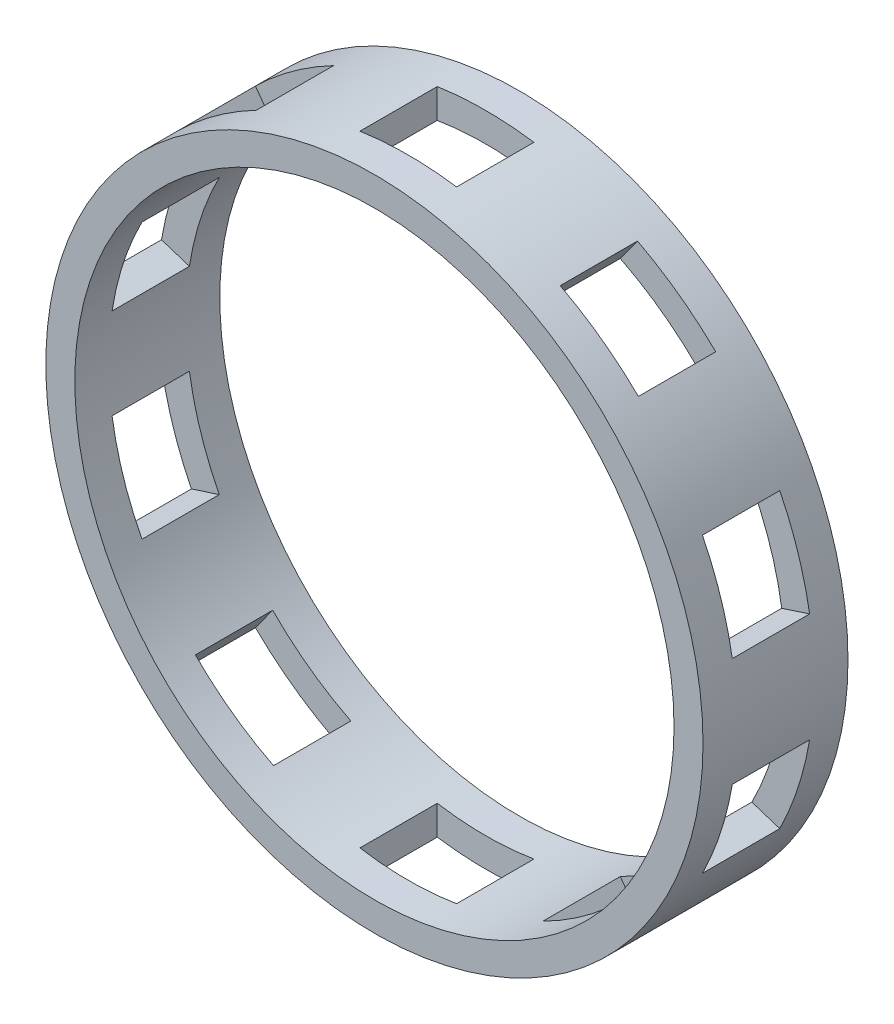
ISO-10303-21;
HEADER;
FILE_DESCRIPTION(('STEP AP214'),'2;1');
FILE_NAME('part.step','',(''),(''),'','','');
FILE_SCHEMA(('AUTOMOTIVE_DESIGN { 1 0 10303 214 1 1 1 1 }'));
ENDSEC;
DATA;
#1=APPLICATION_CONTEXT('core data for automotive mechanical design processes');
#2=APPLICATION_PROTOCOL_DEFINITION('international standard','automotive_design',2000,#1);
#3=PRODUCT_CONTEXT('',#1,'mechanical');
#4=PRODUCT('Part','Part','',(#3));
#5=PRODUCT_RELATED_PRODUCT_CATEGORY('part','',(#4));
#6=PRODUCT_DEFINITION_FORMATION('','',#4);
#7=PRODUCT_DEFINITION_CONTEXT('part definition',#1,'design');
#8=PRODUCT_DEFINITION('design','',#6,#7);
#9=PRODUCT_DEFINITION_SHAPE('','',#8);
#10=(LENGTH_UNIT() NAMED_UNIT(*) SI_UNIT(.MILLI.,.METRE.));
#11=(NAMED_UNIT(*) PLANE_ANGLE_UNIT() SI_UNIT($,.RADIAN.));
#12=(NAMED_UNIT(*) SI_UNIT($,.STERADIAN.) SOLID_ANGLE_UNIT());
#13=UNCERTAINTY_MEASURE_WITH_UNIT(LENGTH_MEASURE(1.E-05),#10,'distance_accuracy_value','');
#14=(GEOMETRIC_REPRESENTATION_CONTEXT(3) GLOBAL_UNCERTAINTY_ASSIGNED_CONTEXT((#13)) GLOBAL_UNIT_ASSIGNED_CONTEXT((#10,
#11,#12)) REPRESENTATION_CONTEXT('',''));
#15=CARTESIAN_POINT('',(0.,0.,0.));
#16=DIRECTION('',(0.,0.,1.));
#17=DIRECTION('',(1.,0.,0.));
#18=AXIS2_PLACEMENT_3D('',#15,#16,#17);
#19=CARTESIAN_POINT('',(0.,0.,30.));
#20=DIRECTION('',(0.,0.,1.));
#21=DIRECTION('',(1.,0.,0.));
#22=AXIS2_PLACEMENT_3D('',#19,#20,#21);
#23=PLANE('',#22);
#24=CARTESIAN_POINT('',(0.,0.,30.));
#25=DIRECTION('',(0.,0.,1.));
#26=DIRECTION('',(1.,0.,0.));
#27=AXIS2_PLACEMENT_3D('',#24,#25,#26);
#28=CIRCLE('',#27,68.);
#29=CARTESIAN_POINT('',(68.,0.,30.));
#30=VERTEX_POINT('',#29);
#31=EDGE_CURVE('E518',#30,#30,#28,.T.);
#32=ORIENTED_EDGE('',*,*,#31,.T.);
#33=EDGE_LOOP('',(#32));
#34=FACE_BOUND('',#33,.T.);
#35=CARTESIAN_POINT('',(0.,0.,30.));
#36=DIRECTION('',(0.,0.,1.));
#37=DIRECTION('',(1.,0.,0.));
#38=AXIS2_PLACEMENT_3D('',#35,#36,#37);
#39=CIRCLE('',#38,62.);
#40=CARTESIAN_POINT('',(62.,0.,30.));
#41=VERTEX_POINT('',#40);
#42=EDGE_CURVE('E512',#41,#41,#39,.T.);
#43=ORIENTED_EDGE('',*,*,#42,.F.);
#44=EDGE_LOOP('',(#43));
#45=FACE_BOUND('',#44,.T.);
#46=ADVANCED_FACE('F33',(#34,#45),#23,.T.);
#47=CARTESIAN_POINT('',(0.,0.,0.));
#48=DIRECTION('',(0.,0.,1.));
#49=DIRECTION('',(1.,0.,0.));
#50=AXIS2_PLACEMENT_3D('',#47,#48,#49);
#51=PLANE('',#50);
#52=CARTESIAN_POINT('',(0.,0.,0.));
#53=DIRECTION('',(0.,0.,1.));
#54=DIRECTION('',(1.,0.,0.));
#55=AXIS2_PLACEMENT_3D('',#52,#53,#54);
#56=CIRCLE('',#55,68.);
#57=CARTESIAN_POINT('',(68.,0.,0.));
#58=VERTEX_POINT('',#57);
#59=EDGE_CURVE('E515',#58,#58,#56,.T.);
#60=ORIENTED_EDGE('',*,*,#59,.F.);
#61=EDGE_LOOP('',(#60));
#62=FACE_BOUND('',#61,.T.);
#63=CARTESIAN_POINT('',(0.,0.,0.));
#64=DIRECTION('',(0.,0.,1.));
#65=DIRECTION('',(1.,0.,0.));
#66=AXIS2_PLACEMENT_3D('',#63,#64,#65);
#67=CIRCLE('',#66,62.);
#68=CARTESIAN_POINT('',(62.,0.,0.));
#69=VERTEX_POINT('',#68);
#70=EDGE_CURVE('E511',#69,#69,#67,.T.);
#71=ORIENTED_EDGE('',*,*,#70,.T.);
#72=EDGE_LOOP('',(#71));
#73=FACE_BOUND('',#72,.T.);
#74=ADVANCED_FACE('F558',(#62,#73),#51,.F.);
#75=CARTESIAN_POINT('',(0.,0.,30.));
#76=DIRECTION('',(0.,0.,-1.));
#77=DIRECTION('',(-1.,0.,0.));
#78=AXIS2_PLACEMENT_3D('',#75,#76,#77);
#79=CYLINDRICAL_SURFACE('',#78,68.);
#80=CARTESIAN_POINT('',(0.,0.,7.));
#81=DIRECTION('',(0.,0.,-1.));
#82=DIRECTION('',(-1.,0.,0.));
#83=AXIS2_PLACEMENT_3D('',#80,#81,#82);
#84=CIRCLE('',#83,68.);
#85=CARTESIAN_POINT('',(-67.0588844945057,11.2741301372895,7.));
#86=VERTEX_POINT('',#85);
#87=CARTESIAN_POINT('',(-60.8785446070068,30.2952604631926,7.));
#88=VERTEX_POINT('',#87);
#89=EDGE_CURVE('E463',#86,#88,#84,.T.);
#90=ORIENTED_EDGE('',*,*,#89,.T.);
#91=DIRECTION('',(0.,0.,-1.));
#92=VECTOR('',#91,1.);
#93=CARTESIAN_POINT('',(-60.8785446070068,30.2952604631926,30.));
#94=LINE('',#93,#92);
#95=CARTESIAN_POINT('',(-60.8785446070068,30.2952604631926,23.));
#96=VERTEX_POINT('',#95);
#97=EDGE_CURVE('E413',#88,#96,#94,.F.);
#98=ORIENTED_EDGE('',*,*,#97,.T.);
#99=CARTESIAN_POINT('',(0.,0.,23.));
#100=DIRECTION('',(0.,0.,1.));
#101=DIRECTION('',(1.,0.,0.));
#102=AXIS2_PLACEMENT_3D('',#99,#100,#101);
#103=CIRCLE('',#102,68.);
#104=CARTESIAN_POINT('',(-67.0588844945057,11.2741301372895,23.));
#105=VERTEX_POINT('',#104);
#106=EDGE_CURVE('E1006',#96,#105,#103,.T.);
#107=ORIENTED_EDGE('',*,*,#106,.T.);
#108=DIRECTION('',(0.,0.,-1.));
#109=VECTOR('',#108,1.);
#110=CARTESIAN_POINT('',(-67.0588844945057,11.2741301372895,30.));
#111=LINE('',#110,#109);
#112=EDGE_CURVE('E464',#105,#86,#111,.T.);
#113=ORIENTED_EDGE('',*,*,#112,.T.);
#114=EDGE_LOOP('',(#90,#98,#107,#113));
#115=FACE_BOUND('',#114,.T.);
#116=DIRECTION('',(0.,0.,-1.));
#117=VECTOR('',#116,1.);
#118=CARTESIAN_POINT('',(60.8785446070068,-30.2952604631926,30.));
#119=LINE('',#118,#117);
#120=CARTESIAN_POINT('',(60.8785446070068,-30.2952604631926,7.));
#121=VERTEX_POINT('',#120);
#122=CARTESIAN_POINT('',(60.8785446070068,-30.2952604631926,23.));
#123=VERTEX_POINT('',#122);
#124=EDGE_CURVE('E473',#121,#123,#119,.F.);
#125=ORIENTED_EDGE('',*,*,#124,.T.);
#126=CARTESIAN_POINT('',(67.0588844945057,-11.2741301372895,23.));
#127=VERTEX_POINT('',#126);
#128=EDGE_CURVE('E466',#123,#127,#103,.T.);
#129=ORIENTED_EDGE('',*,*,#128,.T.);
#130=DIRECTION('',(0.,0.,-1.));
#131=VECTOR('',#130,1.);
#132=CARTESIAN_POINT('',(67.0588844945057,-11.2741301372895,30.));
#133=LINE('',#132,#131);
#134=CARTESIAN_POINT('',(67.0588844945057,-11.2741301372895,7.));
#135=VERTEX_POINT('',#134);
#136=EDGE_CURVE('E470',#127,#135,#133,.T.);
#137=ORIENTED_EDGE('',*,*,#136,.T.);
#138=EDGE_CURVE('E1077',#135,#121,#84,.T.);
#139=ORIENTED_EDGE('',*,*,#138,.T.);
#140=EDGE_LOOP('',(#125,#129,#137,#139));
#141=FACE_BOUND('',#140,.T.);
#142=CARTESIAN_POINT('',(-31.4446698652575,-60.2928912647666,7.));
#143=VERTEX_POINT('',#142);
#144=CARTESIAN_POINT('',(-47.6250097527565,-48.5371862189172,7.));
#145=VERTEX_POINT('',#144);
#146=EDGE_CURVE('E462',#143,#145,#84,.T.);
#147=ORIENTED_EDGE('',*,*,#146,.T.);
#148=DIRECTION('',(0.,0.,-1.));
#149=VECTOR('',#148,1.);
#150=CARTESIAN_POINT('',(-47.6250097527565,-48.5371862189172,30.));
#151=LINE('',#150,#149);
#152=CARTESIAN_POINT('',(-47.6250097527565,-48.5371862189172,23.));
#153=VERTEX_POINT('',#152);
#154=EDGE_CURVE('E453',#145,#153,#151,.F.);
#155=ORIENTED_EDGE('',*,*,#154,.T.);
#156=CARTESIAN_POINT('',(-31.4446698652575,-60.2928912647666,23.));
#157=VERTEX_POINT('',#156);
#158=EDGE_CURVE('E1054',#153,#157,#103,.T.);
#159=ORIENTED_EDGE('',*,*,#158,.T.);
#160=DIRECTION('',(0.,0.,-1.));
#161=VECTOR('',#160,1.);
#162=CARTESIAN_POINT('',(-31.4446698652575,-60.2928912647666,30.));
#163=LINE('',#162,#161);
#164=EDGE_CURVE('E450',#157,#143,#163,.T.);
#165=ORIENTED_EDGE('',*,*,#164,.T.);
#166=EDGE_LOOP('',(#147,#155,#159,#165));
#167=FACE_BOUND('',#166,.T.);
#168=CARTESIAN_POINT('',(47.6250097527572,-48.5371862189165,7.));
#169=VERTEX_POINT('',#168);
#170=CARTESIAN_POINT('',(31.4446698652583,-60.2928912647661,7.));
#171=VERTEX_POINT('',#170);
#172=EDGE_CURVE('E1076',#169,#171,#84,.T.);
#173=ORIENTED_EDGE('',*,*,#172,.T.);
#174=DIRECTION('',(0.,0.,-1.));
#175=VECTOR('',#174,1.);
#176=CARTESIAN_POINT('',(31.4446698652584,-60.2928912647661,30.));
#177=LINE('',#176,#175);
#178=CARTESIAN_POINT('',(31.4446698652583,-60.2928912647661,23.));
#179=VERTEX_POINT('',#178);
#180=EDGE_CURVE('E447',#171,#179,#177,.F.);
#181=ORIENTED_EDGE('',*,*,#180,.T.);
#182=CARTESIAN_POINT('',(47.6250097527572,-48.5371862189165,23.));
#183=VERTEX_POINT('',#182);
#184=EDGE_CURVE('E469',#179,#183,#103,.T.);
#185=ORIENTED_EDGE('',*,*,#184,.T.);
#186=DIRECTION('',(0.,0.,-1.));
#187=VECTOR('',#186,1.);
#188=CARTESIAN_POINT('',(47.6250097527572,-48.5371862189165,30.));
#189=LINE('',#188,#187);
#190=EDGE_CURVE('E444',#183,#169,#189,.T.);
#191=ORIENTED_EDGE('',*,*,#190,.T.);
#192=EDGE_LOOP('',(#173,#181,#185,#191));
#193=FACE_BOUND('',#192,.T.);
#194=CARTESIAN_POINT('',(-67.0588844945056,-11.2741301372904,23.));
#195=VERTEX_POINT('',#194);
#196=CARTESIAN_POINT('',(-60.8785446070064,-30.2952604631934,23.));
#197=VERTEX_POINT('',#196);
#198=EDGE_CURVE('E1053',#195,#197,#103,.T.);
#199=ORIENTED_EDGE('',*,*,#198,.T.);
#200=DIRECTION('',(0.,0.,-1.));
#201=VECTOR('',#200,1.);
#202=CARTESIAN_POINT('',(-60.8785446070064,-30.2952604631934,30.));
#203=LINE('',#202,#201);
#204=CARTESIAN_POINT('',(-60.8785446070064,-30.2952604631934,7.));
#205=VERTEX_POINT('',#204);
#206=EDGE_CURVE('E456',#197,#205,#203,.T.);
#207=ORIENTED_EDGE('',*,*,#206,.T.);
#208=CARTESIAN_POINT('',(-67.0588844945056,-11.2741301372904,7.));
#209=VERTEX_POINT('',#208);
#210=EDGE_CURVE('E459',#205,#209,#84,.T.);
#211=ORIENTED_EDGE('',*,*,#210,.T.);
#212=DIRECTION('',(0.,0.,-1.));
#213=VECTOR('',#212,1.);
#214=CARTESIAN_POINT('',(-67.0588844945056,-11.2741301372904,30.));
#215=LINE('',#214,#213);
#216=EDGE_CURVE('E441',#209,#195,#215,.F.);
#217=ORIENTED_EDGE('',*,*,#216,.T.);
#218=EDGE_LOOP('',(#199,#207,#211,#217));
#219=FACE_BOUND('',#218,.T.);
#220=CARTESIAN_POINT('',(47.6250097527565,48.5371862189172,23.));
#221=VERTEX_POINT('',#220);
#222=CARTESIAN_POINT('',(31.4446698652575,60.2928912647666,23.));
#223=VERTEX_POINT('',#222);
#224=EDGE_CURVE('E1107',#221,#223,#103,.T.);
#225=ORIENTED_EDGE('',*,*,#224,.T.);
#226=DIRECTION('',(0.,0.,-1.));
#227=VECTOR('',#226,1.);
#228=CARTESIAN_POINT('',(31.4446698652575,60.2928912647666,30.));
#229=LINE('',#228,#227);
#230=CARTESIAN_POINT('',(31.4446698652575,60.2928912647666,7.));
#231=VERTEX_POINT('',#230);
#232=EDGE_CURVE('E438',#223,#231,#229,.T.);
#233=ORIENTED_EDGE('',*,*,#232,.T.);
#234=CARTESIAN_POINT('',(47.6250097527565,48.5371862189172,7.));
#235=VERTEX_POINT('',#234);
#236=EDGE_CURVE('E1083',#231,#235,#84,.T.);
#237=ORIENTED_EDGE('',*,*,#236,.T.);
#238=DIRECTION('',(0.,0.,-1.));
#239=VECTOR('',#238,1.);
#240=CARTESIAN_POINT('',(47.6250097527565,48.5371862189172,30.));
#241=LINE('',#240,#239);
#242=EDGE_CURVE('E435',#235,#221,#241,.F.);
#243=ORIENTED_EDGE('',*,*,#242,.T.);
#244=EDGE_LOOP('',(#225,#233,#237,#243));
#245=FACE_BOUND('',#244,.T.);
#246=CARTESIAN_POINT('',(-31.4446698652584,60.2928912647661,23.));
#247=VERTEX_POINT('',#246);
#248=CARTESIAN_POINT('',(-47.6250097527572,48.5371862189165,23.));
#249=VERTEX_POINT('',#248);
#250=EDGE_CURVE('E1055',#247,#249,#103,.T.);
#251=ORIENTED_EDGE('',*,*,#250,.T.);
#252=DIRECTION('',(0.,0.,-1.));
#253=VECTOR('',#252,1.);
#254=CARTESIAN_POINT('',(-47.6250097527572,48.5371862189165,30.));
#255=LINE('',#254,#253);
#256=CARTESIAN_POINT('',(-47.6250097527572,48.5371862189165,7.));
#257=VERTEX_POINT('',#256);
#258=EDGE_CURVE('E432',#249,#257,#255,.T.);
#259=ORIENTED_EDGE('',*,*,#258,.T.);
#260=CARTESIAN_POINT('',(-31.4446698652584,60.2928912647661,7.));
#261=VERTEX_POINT('',#260);
#262=EDGE_CURVE('E1086',#257,#261,#84,.T.);
#263=ORIENTED_EDGE('',*,*,#262,.T.);
#264=DIRECTION('',(0.,0.,-1.));
#265=VECTOR('',#264,1.);
#266=CARTESIAN_POINT('',(-31.4446698652584,60.2928912647661,30.));
#267=LINE('',#266,#265);
#268=EDGE_CURVE('E429',#261,#247,#267,.F.);
#269=ORIENTED_EDGE('',*,*,#268,.T.);
#270=EDGE_LOOP('',(#251,#259,#263,#269));
#271=FACE_BOUND('',#270,.T.);
#272=CARTESIAN_POINT('',(67.0588844945056,11.2741301372904,23.));
#273=VERTEX_POINT('',#272);
#274=CARTESIAN_POINT('',(60.8785446070064,30.2952604631934,23.));
#275=VERTEX_POINT('',#274);
#276=EDGE_CURVE('E308',#273,#275,#103,.T.);
#277=ORIENTED_EDGE('',*,*,#276,.T.);
#278=DIRECTION('',(0.,0.,-1.));
#279=VECTOR('',#278,1.);
#280=CARTESIAN_POINT('',(60.8785446070064,30.2952604631934,30.));
#281=LINE('',#280,#279);
#282=CARTESIAN_POINT('',(60.8785446070064,30.2952604631934,7.));
#283=VERTEX_POINT('',#282);
#284=EDGE_CURVE('E425',#275,#283,#281,.T.);
#285=ORIENTED_EDGE('',*,*,#284,.T.);
#286=CARTESIAN_POINT('',(67.0588844945056,11.2741301372904,7.));
#287=VERTEX_POINT('',#286);
#288=EDGE_CURVE('E1080',#283,#287,#84,.T.);
#289=ORIENTED_EDGE('',*,*,#288,.T.);
#290=DIRECTION('',(0.,0.,-1.));
#291=VECTOR('',#290,1.);
#292=CARTESIAN_POINT('',(67.0588844945056,11.2741301372904,30.));
#293=LINE('',#292,#291);
#294=EDGE_CURVE('E423',#287,#273,#293,.F.);
#295=ORIENTED_EDGE('',*,*,#294,.T.);
#296=EDGE_LOOP('',(#277,#285,#289,#295));
#297=FACE_BOUND('',#296,.T.);
#298=DIRECTION('',(0.,0.,-1.));
#299=VECTOR('',#298,1.);
#300=CARTESIAN_POINT('',(10.,-67.2606868832009,30.));
#301=LINE('',#300,#299);
#302=CARTESIAN_POINT('',(10.,-67.2606868832009,23.));
#303=VERTEX_POINT('',#302);
#304=CARTESIAN_POINT('',(10.,-67.2606868832009,7.));
#305=VERTEX_POINT('',#304);
#306=EDGE_CURVE('E508',#303,#305,#301,.T.);
#307=ORIENTED_EDGE('',*,*,#306,.T.);
#308=CARTESIAN_POINT('',(0.,0.,7.));
#309=DIRECTION('',(0.,0.,-1.));
#310=DIRECTION('',(-1.,0.,0.));
#311=AXIS2_PLACEMENT_3D('',#308,#309,#310);
#312=CIRCLE('',#311,68.);
#313=CARTESIAN_POINT('',(-10.,-67.2606868832009,7.));
#314=VERTEX_POINT('',#313);
#315=EDGE_CURVE('E496',#305,#314,#312,.T.);
#316=ORIENTED_EDGE('',*,*,#315,.T.);
#317=DIRECTION('',(0.,0.,-1.));
#318=VECTOR('',#317,1.);
#319=CARTESIAN_POINT('',(-10.,-67.2606868832009,30.));
#320=LINE('',#319,#318);
#321=CARTESIAN_POINT('',(-10.,-67.2606868832009,23.));
#322=VERTEX_POINT('',#321);
#323=EDGE_CURVE('E495',#314,#322,#320,.F.);
#324=ORIENTED_EDGE('',*,*,#323,.T.);
#325=CARTESIAN_POINT('',(0.,0.,23.));
#326=DIRECTION('',(0.,0.,1.));
#327=DIRECTION('',(1.,0.,0.));
#328=AXIS2_PLACEMENT_3D('',#325,#326,#327);
#329=CIRCLE('',#328,68.);
#330=EDGE_CURVE('E502',#322,#303,#329,.T.);
#331=ORIENTED_EDGE('',*,*,#330,.T.);
#332=EDGE_LOOP('',(#307,#316,#324,#331));
#333=FACE_BOUND('',#332,.T.);
#334=DIRECTION('',(0.,0.,-1.));
#335=VECTOR('',#334,1.);
#336=CARTESIAN_POINT('',(-10.,67.2606868832009,30.));
#337=LINE('',#336,#335);
#338=CARTESIAN_POINT('',(-10.,67.2606868832009,23.));
#339=VERTEX_POINT('',#338);
#340=CARTESIAN_POINT('',(-10.,67.2606868832009,7.));
#341=VERTEX_POINT('',#340);
#342=EDGE_CURVE('E499',#339,#341,#337,.T.);
#343=ORIENTED_EDGE('',*,*,#342,.T.);
#344=CARTESIAN_POINT('',(10.,67.2606868832009,7.));
#345=VERTEX_POINT('',#344);
#346=EDGE_CURVE('E493',#341,#345,#312,.T.);
#347=ORIENTED_EDGE('',*,*,#346,.T.);
#348=DIRECTION('',(0.,0.,-1.));
#349=VECTOR('',#348,1.);
#350=CARTESIAN_POINT('',(10.,67.2606868832009,30.));
#351=LINE('',#350,#349);
#352=CARTESIAN_POINT('',(10.,67.2606868832009,23.));
#353=VERTEX_POINT('',#352);
#354=EDGE_CURVE('E505',#345,#353,#351,.F.);
#355=ORIENTED_EDGE('',*,*,#354,.T.);
#356=EDGE_CURVE('E503',#353,#339,#329,.T.);
#357=ORIENTED_EDGE('',*,*,#356,.T.);
#358=EDGE_LOOP('',(#343,#347,#355,#357));
#359=FACE_BOUND('',#358,.T.);
#360=ORIENTED_EDGE('',*,*,#31,.F.);
#361=EDGE_LOOP('',(#360));
#362=FACE_BOUND('',#361,.T.);
#363=ORIENTED_EDGE('',*,*,#59,.T.);
#364=EDGE_LOOP('',(#363));
#365=FACE_BOUND('',#364,.T.);
#366=ADVANCED_FACE('F35',(#115,#141,#167,#193,#219,#245,#271,#297,#333,#359,#362,#365),#79,.T.);
#367=CARTESIAN_POINT('',(0.,0.,30.));
#368=DIRECTION('',(0.,0.,-1.));
#369=DIRECTION('',(-1.,0.,0.));
#370=AXIS2_PLACEMENT_3D('',#367,#368,#369);
#371=CYLINDRICAL_SURFACE('',#370,62.);
#372=DIRECTION('',(0.,0.,-1.));
#373=VECTOR('',#372,1.);
#374=CARTESIAN_POINT('',(-55.1032988776733,28.4187693751472,30.));
#375=LINE('',#374,#373);
#376=CARTESIAN_POINT('',(-55.1032988776734,28.4187693751472,7.));
#377=VERTEX_POINT('',#376);
#378=CARTESIAN_POINT('',(-55.1032988776734,28.4187693751472,23.));
#379=VERTEX_POINT('',#378);
#380=EDGE_CURVE('E11',#377,#379,#375,.F.);
#381=ORIENTED_EDGE('',*,*,#380,.F.);
#382=CARTESIAN_POINT('',(0.,0.,7.));
#383=DIRECTION('',(0.,0.,-1.));
#384=DIRECTION('',(-1.,0.,0.));
#385=AXIS2_PLACEMENT_3D('',#382,#383,#384);
#386=CIRCLE('',#385,62.);
#387=CARTESIAN_POINT('',(-61.2836387651722,9.39763904924408,7.));
#388=VERTEX_POINT('',#387);
#389=EDGE_CURVE('E322',#388,#377,#386,.T.);
#390=ORIENTED_EDGE('',*,*,#389,.F.);
#391=DIRECTION('',(0.,0.,-1.));
#392=VECTOR('',#391,1.);
#393=CARTESIAN_POINT('',(-61.2836387651722,9.39763904924408,30.));
#394=LINE('',#393,#392);
#395=CARTESIAN_POINT('',(-61.2836387651722,9.39763904924407,23.));
#396=VERTEX_POINT('',#395);
#397=EDGE_CURVE('E324',#396,#388,#394,.T.);
#398=ORIENTED_EDGE('',*,*,#397,.F.);
#399=CARTESIAN_POINT('',(0.,0.,23.));
#400=DIRECTION('',(0.,0.,1.));
#401=DIRECTION('',(1.,0.,0.));
#402=AXIS2_PLACEMENT_3D('',#399,#400,#401);
#403=CIRCLE('',#402,62.);
#404=EDGE_CURVE('E41',#379,#396,#403,.T.);
#405=ORIENTED_EDGE('',*,*,#404,.F.);
#406=EDGE_LOOP('',(#381,#390,#398,#405));
#407=FACE_BOUND('',#406,.T.);
#408=CARTESIAN_POINT('',(55.1032988776734,-28.4187693751472,23.));
#409=VERTEX_POINT('',#408);
#410=CARTESIAN_POINT('',(61.2836387651722,-9.39763904924408,23.));
#411=VERTEX_POINT('',#410);
#412=EDGE_CURVE('E325',#409,#411,#403,.T.);
#413=ORIENTED_EDGE('',*,*,#412,.F.);
#414=DIRECTION('',(0.,0.,-1.));
#415=VECTOR('',#414,1.);
#416=CARTESIAN_POINT('',(55.1032988776733,-28.4187693751472,30.));
#417=LINE('',#416,#415);
#418=CARTESIAN_POINT('',(55.1032988776734,-28.4187693751472,7.));
#419=VERTEX_POINT('',#418);
#420=EDGE_CURVE('E379',#419,#409,#417,.F.);
#421=ORIENTED_EDGE('',*,*,#420,.F.);
#422=CARTESIAN_POINT('',(61.2836387651722,-9.39763904924408,7.));
#423=VERTEX_POINT('',#422);
#424=EDGE_CURVE('E377',#423,#419,#386,.T.);
#425=ORIENTED_EDGE('',*,*,#424,.F.);
#426=DIRECTION('',(0.,0.,-1.));
#427=VECTOR('',#426,1.);
#428=CARTESIAN_POINT('',(61.2836387651722,-9.39763904924408,30.));
#429=LINE('',#428,#427);
#430=EDGE_CURVE('E385',#411,#423,#429,.T.);
#431=ORIENTED_EDGE('',*,*,#430,.F.);
#432=EDGE_LOOP('',(#413,#421,#425,#431));
#433=FACE_BOUND('',#432,.T.);
#434=DIRECTION('',(0.,0.,-1.));
#435=VECTOR('',#434,1.);
#436=CARTESIAN_POINT('',(-44.0557115986458,-43.624468770828,30.));
#437=LINE('',#436,#435);
#438=CARTESIAN_POINT('',(-44.0557115986458,-43.624468770828,7.));
#439=VERTEX_POINT('',#438);
#440=CARTESIAN_POINT('',(-44.0557115986458,-43.624468770828,23.));
#441=VERTEX_POINT('',#440);
#442=EDGE_CURVE('E371',#439,#441,#437,.F.);
#443=ORIENTED_EDGE('',*,*,#442,.F.);
#444=CARTESIAN_POINT('',(-27.8753717111468,-55.3801738166774,7.));
#445=VERTEX_POINT('',#444);
#446=EDGE_CURVE('E369',#445,#439,#386,.T.);
#447=ORIENTED_EDGE('',*,*,#446,.F.);
#448=DIRECTION('',(0.,0.,-1.));
#449=VECTOR('',#448,1.);
#450=CARTESIAN_POINT('',(-27.8753717111468,-55.3801738166774,30.));
#451=LINE('',#450,#449);
#452=CARTESIAN_POINT('',(-27.8753717111468,-55.3801738166774,23.));
#453=VERTEX_POINT('',#452);
#454=EDGE_CURVE('E367',#453,#445,#451,.T.);
#455=ORIENTED_EDGE('',*,*,#454,.F.);
#456=EDGE_CURVE('E361',#441,#453,#403,.T.);
#457=ORIENTED_EDGE('',*,*,#456,.F.);
#458=EDGE_LOOP('',(#443,#447,#455,#457));
#459=FACE_BOUND('',#458,.T.);
#460=DIRECTION('',(0.,0.,-1.));
#461=VECTOR('',#460,1.);
#462=CARTESIAN_POINT('',(27.8753717111476,-55.380173816677,30.));
#463=LINE('',#462,#461);
#464=CARTESIAN_POINT('',(27.8753717111476,-55.380173816677,7.));
#465=VERTEX_POINT('',#464);
#466=CARTESIAN_POINT('',(27.8753717111476,-55.380173816677,23.));
#467=VERTEX_POINT('',#466);
#468=EDGE_CURVE('E360',#465,#467,#463,.F.);
#469=ORIENTED_EDGE('',*,*,#468,.F.);
#470=CARTESIAN_POINT('',(44.0557115986464,-43.6244687708274,7.));
#471=VERTEX_POINT('',#470);
#472=EDGE_CURVE('E358',#471,#465,#386,.T.);
#473=ORIENTED_EDGE('',*,*,#472,.F.);
#474=DIRECTION('',(0.,0.,-1.));
#475=VECTOR('',#474,1.);
#476=CARTESIAN_POINT('',(44.0557115986464,-43.6244687708274,30.));
#477=LINE('',#476,#475);
#478=CARTESIAN_POINT('',(44.0557115986464,-43.6244687708274,23.));
#479=VERTEX_POINT('',#478);
#480=EDGE_CURVE('E355',#479,#471,#477,.T.);
#481=ORIENTED_EDGE('',*,*,#480,.F.);
#482=EDGE_CURVE('E349',#467,#479,#403,.T.);
#483=ORIENTED_EDGE('',*,*,#482,.F.);
#484=EDGE_LOOP('',(#469,#473,#481,#483));
#485=FACE_BOUND('',#484,.T.);
#486=DIRECTION('',(0.,0.,-1.));
#487=VECTOR('',#486,1.);
#488=CARTESIAN_POINT('',(-55.1032988776729,-28.4187693751479,30.));
#489=LINE('',#488,#487);
#490=CARTESIAN_POINT('',(-55.1032988776729,-28.4187693751479,23.));
#491=VERTEX_POINT('',#490);
#492=CARTESIAN_POINT('',(-55.1032988776729,-28.4187693751479,7.));
#493=VERTEX_POINT('',#492);
#494=EDGE_CURVE('E348',#491,#493,#489,.T.);
#495=ORIENTED_EDGE('',*,*,#494,.F.);
#496=CARTESIAN_POINT('',(-61.2836387651721,-9.39763904924494,23.));
#497=VERTEX_POINT('',#496);
#498=EDGE_CURVE('E338',#497,#491,#403,.T.);
#499=ORIENTED_EDGE('',*,*,#498,.F.);
#500=DIRECTION('',(0.,0.,-1.));
#501=VECTOR('',#500,1.);
#502=CARTESIAN_POINT('',(-61.2836387651721,-9.39763904924494,30.));
#503=LINE('',#502,#501);
#504=CARTESIAN_POINT('',(-61.2836387651721,-9.39763904924494,7.));
#505=VERTEX_POINT('',#504);
#506=EDGE_CURVE('E344',#505,#497,#503,.F.);
#507=ORIENTED_EDGE('',*,*,#506,.F.);
#508=EDGE_CURVE('E347',#493,#505,#386,.T.);
#509=ORIENTED_EDGE('',*,*,#508,.F.);
#510=EDGE_LOOP('',(#495,#499,#507,#509));
#511=FACE_BOUND('',#510,.T.);
#512=DIRECTION('',(0.,0.,-1.));
#513=VECTOR('',#512,1.);
#514=CARTESIAN_POINT('',(27.8753717111467,55.3801738166774,30.));
#515=LINE('',#514,#513);
#516=CARTESIAN_POINT('',(27.8753717111468,55.3801738166774,23.));
#517=VERTEX_POINT('',#516);
#518=CARTESIAN_POINT('',(27.8753717111468,55.3801738166774,7.));
#519=VERTEX_POINT('',#518);
#520=EDGE_CURVE('E337',#517,#519,#515,.T.);
#521=ORIENTED_EDGE('',*,*,#520,.F.);
#522=CARTESIAN_POINT('',(44.0557115986458,43.624468770828,23.));
#523=VERTEX_POINT('',#522);
#524=EDGE_CURVE('E327',#523,#517,#403,.T.);
#525=ORIENTED_EDGE('',*,*,#524,.F.);
#526=DIRECTION('',(0.,0.,-1.));
#527=VECTOR('',#526,1.);
#528=CARTESIAN_POINT('',(44.0557115986458,43.624468770828,30.));
#529=LINE('',#528,#527);
#530=CARTESIAN_POINT('',(44.0557115986458,43.624468770828,7.));
#531=VERTEX_POINT('',#530);
#532=EDGE_CURVE('E333',#531,#523,#529,.F.);
#533=ORIENTED_EDGE('',*,*,#532,.F.);
#534=EDGE_CURVE('E336',#519,#531,#386,.T.);
#535=ORIENTED_EDGE('',*,*,#534,.F.);
#536=EDGE_LOOP('',(#521,#525,#533,#535));
#537=FACE_BOUND('',#536,.T.);
#538=DIRECTION('',(0.,0.,-1.));
#539=VECTOR('',#538,1.);
#540=CARTESIAN_POINT('',(-44.0557115986464,43.6244687708274,30.));
#541=LINE('',#540,#539);
#542=CARTESIAN_POINT('',(-44.0557115986464,43.6244687708274,23.));
#543=VERTEX_POINT('',#542);
#544=CARTESIAN_POINT('',(-44.0557115986464,43.6244687708274,7.));
#545=VERTEX_POINT('',#544);
#546=EDGE_CURVE('E326',#543,#545,#541,.T.);
#547=ORIENTED_EDGE('',*,*,#546,.F.);
#548=CARTESIAN_POINT('',(-27.8753717111476,55.380173816677,23.));
#549=VERTEX_POINT('',#548);
#550=EDGE_CURVE('E318',#549,#543,#403,.T.);
#551=ORIENTED_EDGE('',*,*,#550,.F.);
#552=DIRECTION('',(0.,0.,-1.));
#553=VECTOR('',#552,1.);
#554=CARTESIAN_POINT('',(-27.8753717111476,55.380173816677,30.));
#555=LINE('',#554,#553);
#556=CARTESIAN_POINT('',(-27.8753717111476,55.380173816677,7.));
#557=VERTEX_POINT('',#556);
#558=EDGE_CURVE('E319',#557,#549,#555,.F.);
#559=ORIENTED_EDGE('',*,*,#558,.F.);
#560=EDGE_CURVE('E323',#545,#557,#386,.T.);
#561=ORIENTED_EDGE('',*,*,#560,.F.);
#562=EDGE_LOOP('',(#547,#551,#559,#561));
#563=FACE_BOUND('',#562,.T.);
#564=DIRECTION('',(0.,0.,-1.));
#565=VECTOR('',#564,1.);
#566=CARTESIAN_POINT('',(55.1032988776729,28.4187693751479,30.));
#567=LINE('',#566,#565);
#568=CARTESIAN_POINT('',(55.1032988776729,28.4187693751479,23.));
#569=VERTEX_POINT('',#568);
#570=CARTESIAN_POINT('',(55.1032988776729,28.4187693751479,7.));
#571=VERTEX_POINT('',#570);
#572=EDGE_CURVE('E316',#569,#571,#567,.T.);
#573=ORIENTED_EDGE('',*,*,#572,.F.);
#574=CARTESIAN_POINT('',(61.2836387651721,9.39763904924493,23.));
#575=VERTEX_POINT('',#574);
#576=EDGE_CURVE('E305',#575,#569,#403,.T.);
#577=ORIENTED_EDGE('',*,*,#576,.F.);
#578=DIRECTION('',(0.,0.,-1.));
#579=VECTOR('',#578,1.);
#580=CARTESIAN_POINT('',(61.2836387651721,9.39763904924494,30.));
#581=LINE('',#580,#579);
#582=CARTESIAN_POINT('',(61.2836387651721,9.39763904924494,7.));
#583=VERTEX_POINT('',#582);
#584=EDGE_CURVE('E288',#583,#575,#581,.F.);
#585=ORIENTED_EDGE('',*,*,#584,.F.);
#586=EDGE_CURVE('E299',#571,#583,#386,.T.);
#587=ORIENTED_EDGE('',*,*,#586,.F.);
#588=EDGE_LOOP('',(#573,#577,#585,#587));
#589=FACE_BOUND('',#588,.T.);
#590=DIRECTION('',(0.,0.,-1.));
#591=VECTOR('',#590,1.);
#592=CARTESIAN_POINT('',(10.,61.1882341631134,30.));
#593=LINE('',#592,#591);
#594=CARTESIAN_POINT('',(10.,61.1882341631134,7.));
#595=VERTEX_POINT('',#594);
#596=CARTESIAN_POINT('',(10.,61.1882341631134,23.));
#597=VERTEX_POINT('',#596);
#598=EDGE_CURVE('E300',#595,#597,#593,.F.);
#599=ORIENTED_EDGE('',*,*,#598,.F.);
#600=CARTESIAN_POINT('',(0.,0.,7.));
#601=DIRECTION('',(0.,0.,-1.));
#602=DIRECTION('',(-1.,0.,0.));
#603=AXIS2_PLACEMENT_3D('',#600,#601,#602);
#604=CIRCLE('',#603,62.);
#605=CARTESIAN_POINT('',(-10.,61.1882341631134,7.));
#606=VERTEX_POINT('',#605);
#607=EDGE_CURVE('E526',#606,#595,#604,.T.);
#608=ORIENTED_EDGE('',*,*,#607,.F.);
#609=DIRECTION('',(0.,0.,-1.));
#610=VECTOR('',#609,1.);
#611=CARTESIAN_POINT('',(-10.,61.1882341631134,30.));
#612=LINE('',#611,#610);
#613=CARTESIAN_POINT('',(-10.,61.1882341631134,23.));
#614=VERTEX_POINT('',#613);
#615=EDGE_CURVE('E534',#614,#606,#612,.T.);
#616=ORIENTED_EDGE('',*,*,#615,.F.);
#617=CARTESIAN_POINT('',(0.,0.,23.));
#618=DIRECTION('',(0.,0.,1.));
#619=DIRECTION('',(1.,0.,0.));
#620=AXIS2_PLACEMENT_3D('',#617,#618,#619);
#621=CIRCLE('',#620,62.);
#622=EDGE_CURVE('E531',#597,#614,#621,.T.);
#623=ORIENTED_EDGE('',*,*,#622,.F.);
#624=EDGE_LOOP('',(#599,#608,#616,#623));
#625=FACE_BOUND('',#624,.T.);
#626=DIRECTION('',(0.,0.,-1.));
#627=VECTOR('',#626,1.);
#628=CARTESIAN_POINT('',(10.,-61.1882341631134,30.));
#629=LINE('',#628,#627);
#630=CARTESIAN_POINT('',(10.,-61.1882341631134,23.));
#631=VERTEX_POINT('',#630);
#632=CARTESIAN_POINT('',(10.,-61.1882341631134,7.));
#633=VERTEX_POINT('',#632);
#634=EDGE_CURVE('E530',#631,#633,#629,.T.);
#635=ORIENTED_EDGE('',*,*,#634,.F.);
#636=CARTESIAN_POINT('',(-10.,-61.1882341631134,23.));
#637=VERTEX_POINT('',#636);
#638=EDGE_CURVE('E528',#637,#631,#621,.T.);
#639=ORIENTED_EDGE('',*,*,#638,.F.);
#640=DIRECTION('',(0.,0.,-1.));
#641=VECTOR('',#640,1.);
#642=CARTESIAN_POINT('',(-10.,-61.1882341631134,30.));
#643=LINE('',#642,#641);
#644=CARTESIAN_POINT('',(-10.,-61.1882341631134,7.));
#645=VERTEX_POINT('',#644);
#646=EDGE_CURVE('E525',#645,#637,#643,.F.);
#647=ORIENTED_EDGE('',*,*,#646,.F.);
#648=EDGE_CURVE('E521',#633,#645,#604,.T.);
#649=ORIENTED_EDGE('',*,*,#648,.F.);
#650=EDGE_LOOP('',(#635,#639,#647,#649));
#651=FACE_BOUND('',#650,.T.);
#652=ORIENTED_EDGE('',*,*,#42,.T.);
#653=EDGE_LOOP('',(#652));
#654=FACE_BOUND('',#653,.T.);
#655=ORIENTED_EDGE('',*,*,#70,.F.);
#656=EDGE_LOOP('',(#655));
#657=FACE_BOUND('',#656,.T.);
#658=ADVANCED_FACE('F314',(#407,#433,#459,#485,#511,#537,#563,#589,#625,#651,#654,#657),#371,.F.);
#659=CARTESIAN_POINT('',(-10.,-68.,7.));
#660=DIRECTION('',(0.,0.,-1.));
#661=DIRECTION('',(-1.,0.,0.));
#662=AXIS2_PLACEMENT_3D('',#659,#660,#661);
#663=PLANE('',#662);
#664=DIRECTION('',(0.,1.,0.));
#665=VECTOR('',#664,1.);
#666=CARTESIAN_POINT('',(10.,-68.,7.));
#667=LINE('',#666,#665);
#668=EDGE_CURVE('E490',#305,#633,#667,.T.);
#669=ORIENTED_EDGE('',*,*,#668,.T.);
#670=ORIENTED_EDGE('',*,*,#648,.T.);
#671=DIRECTION('',(0.,1.,0.));
#672=VECTOR('',#671,1.);
#673=CARTESIAN_POINT('',(-10.,-68.,7.));
#674=LINE('',#673,#672);
#675=EDGE_CURVE('E486',#314,#645,#674,.T.);
#676=ORIENTED_EDGE('',*,*,#675,.F.);
#677=ORIENTED_EDGE('',*,*,#315,.F.);
#678=EDGE_LOOP('',(#669,#670,#676,#677));
#679=FACE_BOUND('',#678,.T.);
#680=ADVANCED_FACE('F569',(#679),#663,.F.);
#681=CARTESIAN_POINT('',(-10.,-68.,23.));
#682=DIRECTION('',(-1.,0.,0.));
#683=DIRECTION('',(0.,0.,1.));
#684=AXIS2_PLACEMENT_3D('',#681,#682,#683);
#685=PLANE('',#684);
#686=ORIENTED_EDGE('',*,*,#675,.T.);
#687=ORIENTED_EDGE('',*,*,#646,.T.);
#688=DIRECTION('',(0.,1.,0.));
#689=VECTOR('',#688,1.);
#690=CARTESIAN_POINT('',(-10.,-68.,23.));
#691=LINE('',#690,#689);
#692=EDGE_CURVE('E482',#322,#637,#691,.T.);
#693=ORIENTED_EDGE('',*,*,#692,.F.);
#694=ORIENTED_EDGE('',*,*,#323,.F.);
#695=EDGE_LOOP('',(#686,#687,#693,#694));
#696=FACE_BOUND('',#695,.T.);
#697=ADVANCED_FACE('F574',(#696),#685,.F.);
#698=CARTESIAN_POINT('',(-10.,-68.,23.));
#699=DIRECTION('',(0.,0.,1.));
#700=DIRECTION('',(1.,0.,0.));
#701=AXIS2_PLACEMENT_3D('',#698,#699,#700);
#702=PLANE('',#701);
#703=ORIENTED_EDGE('',*,*,#692,.T.);
#704=ORIENTED_EDGE('',*,*,#638,.T.);
#705=DIRECTION('',(0.,1.,0.));
#706=VECTOR('',#705,1.);
#707=CARTESIAN_POINT('',(10.,-68.,23.));
#708=LINE('',#707,#706);
#709=EDGE_CURVE('E481',#303,#631,#708,.T.);
#710=ORIENTED_EDGE('',*,*,#709,.F.);
#711=ORIENTED_EDGE('',*,*,#330,.F.);
#712=EDGE_LOOP('',(#703,#704,#710,#711));
#713=FACE_BOUND('',#712,.T.);
#714=ADVANCED_FACE('F931',(#713),#702,.F.);
#715=CARTESIAN_POINT('',(10.,-68.,23.));
#716=DIRECTION('',(1.,0.,0.));
#717=DIRECTION('',(0.,0.,-1.));
#718=AXIS2_PLACEMENT_3D('',#715,#716,#717);
#719=PLANE('',#718);
#720=ORIENTED_EDGE('',*,*,#709,.T.);
#721=ORIENTED_EDGE('',*,*,#634,.T.);
#722=ORIENTED_EDGE('',*,*,#668,.F.);
#723=ORIENTED_EDGE('',*,*,#306,.F.);
#724=EDGE_LOOP('',(#720,#721,#722,#723));
#725=FACE_BOUND('',#724,.T.);
#726=ADVANCED_FACE('F933',(#725),#719,.F.);
#727=EDGE_CURVE('E477',#595,#345,#667,.T.);
#728=ORIENTED_EDGE('',*,*,#727,.F.);
#729=ORIENTED_EDGE('',*,*,#598,.T.);
#730=EDGE_CURVE('E478',#597,#353,#708,.T.);
#731=ORIENTED_EDGE('',*,*,#730,.T.);
#732=ORIENTED_EDGE('',*,*,#354,.F.);
#733=EDGE_LOOP('',(#728,#729,#731,#732));
#734=FACE_BOUND('',#733,.T.);
#735=ADVANCED_FACE('F554',(#734),#719,.F.);
#736=ORIENTED_EDGE('',*,*,#730,.F.);
#737=ORIENTED_EDGE('',*,*,#622,.T.);
#738=EDGE_CURVE('E483',#614,#339,#691,.T.);
#739=ORIENTED_EDGE('',*,*,#738,.T.);
#740=ORIENTED_EDGE('',*,*,#356,.F.);
#741=EDGE_LOOP('',(#736,#737,#739,#740));
#742=FACE_BOUND('',#741,.T.);
#743=ADVANCED_FACE('F544',(#742),#702,.F.);
#744=ORIENTED_EDGE('',*,*,#738,.F.);
#745=ORIENTED_EDGE('',*,*,#615,.T.);
#746=EDGE_CURVE('E487',#606,#341,#674,.T.);
#747=ORIENTED_EDGE('',*,*,#746,.T.);
#748=ORIENTED_EDGE('',*,*,#342,.F.);
#749=EDGE_LOOP('',(#744,#745,#747,#748));
#750=FACE_BOUND('',#749,.T.);
#751=ADVANCED_FACE('F548',(#750),#685,.F.);
#752=ORIENTED_EDGE('',*,*,#746,.F.);
#753=ORIENTED_EDGE('',*,*,#607,.T.);
#754=ORIENTED_EDGE('',*,*,#727,.T.);
#755=ORIENTED_EDGE('',*,*,#346,.F.);
#756=EDGE_LOOP('',(#752,#753,#754,#755));
#757=FACE_BOUND('',#756,.T.);
#758=ADVANCED_FACE('F552',(#757),#663,.F.);
#759=CARTESIAN_POINT('',(-78.4011064429429,-35.9886859321485,23.));
#760=DIRECTION('',(0.309016994374958,-0.95105651629515,0.));
#761=DIRECTION('',(0.95105651629515,0.309016994374958,0.));
#762=AXIS2_PLACEMENT_3D('',#759,#760,#761);
#763=PLANE('',#762);
#764=DIRECTION('',(0.95105651629515,0.309016994374958,0.));
#765=VECTOR('',#764,1.);
#766=CARTESIAN_POINT('',(-78.4011064429429,-35.9886859321485,7.));
#767=LINE('',#766,#765);
#768=EDGE_CURVE('E294',#583,#287,#767,.T.);
#769=ORIENTED_EDGE('',*,*,#768,.F.);
#770=ORIENTED_EDGE('',*,*,#584,.T.);
#771=DIRECTION('',(0.95105651629515,0.309016994374958,0.));
#772=VECTOR('',#771,1.);
#773=CARTESIAN_POINT('',(-78.4011064429429,-35.9886859321485,23.));
#774=LINE('',#773,#772);
#775=EDGE_CURVE('E291',#575,#273,#774,.T.);
#776=ORIENTED_EDGE('',*,*,#775,.T.);
#777=ORIENTED_EDGE('',*,*,#294,.F.);
#778=EDGE_LOOP('',(#769,#770,#776,#777));
#779=FACE_BOUND('',#778,.T.);
#780=ADVANCED_FACE('F290',(#779),#763,.F.);
#781=CARTESIAN_POINT('',(-84.581446330442,-16.9675556062455,23.));
#782=DIRECTION('',(-0.309016994374958,0.95105651629515,0.));
#783=DIRECTION('',(-0.95105651629515,-0.309016994374958,0.));
#784=AXIS2_PLACEMENT_3D('',#781,#782,#783);
#785=PLANE('',#784);
#786=DIRECTION('',(0.95105651629515,0.309016994374958,0.));
#787=VECTOR('',#786,1.);
#788=CARTESIAN_POINT('',(-84.581446330442,-16.9675556062455,23.));
#789=LINE('',#788,#787);
#790=EDGE_CURVE('E1041',#569,#275,#789,.T.);
#791=ORIENTED_EDGE('',*,*,#790,.F.);
#792=ORIENTED_EDGE('',*,*,#572,.T.);
#793=DIRECTION('',(0.95105651629515,0.309016994374958,0.));
#794=VECTOR('',#793,1.);
#795=CARTESIAN_POINT('',(-84.581446330442,-16.9675556062455,7.));
#796=LINE('',#795,#794);
#797=EDGE_CURVE('E1038',#571,#283,#796,.T.);
#798=ORIENTED_EDGE('',*,*,#797,.T.);
#799=ORIENTED_EDGE('',*,*,#284,.F.);
#800=EDGE_LOOP('',(#791,#792,#798,#799));
#801=FACE_BOUND('',#800,.T.);
#802=ADVANCED_FACE('F614',(#801),#785,.F.);
#803=CARTESIAN_POINT('',(78.4011064429428,-35.9886859321472,7.));
#804=DIRECTION('',(0.,0.,-1.));
#805=DIRECTION('',(-1.,0.,0.));
#806=AXIS2_PLACEMENT_3D('',#803,#804,#805);
#807=PLANE('',#806);
#808=ORIENTED_EDGE('',*,*,#797,.F.);
#809=ORIENTED_EDGE('',*,*,#586,.T.);
#810=ORIENTED_EDGE('',*,*,#768,.T.);
#811=ORIENTED_EDGE('',*,*,#288,.F.);
#812=EDGE_LOOP('',(#808,#809,#810,#811));
#813=FACE_BOUND('',#812,.T.);
#814=ADVANCED_FACE('F624',(#813),#807,.F.);
#815=CARTESIAN_POINT('',(78.4011064429428,-35.9886859321472,23.));
#816=DIRECTION('',(0.,0.,1.));
#817=DIRECTION('',(1.,0.,0.));
#818=AXIS2_PLACEMENT_3D('',#815,#816,#817);
#819=PLANE('',#818);
#820=ORIENTED_EDGE('',*,*,#775,.F.);
#821=ORIENTED_EDGE('',*,*,#576,.T.);
#822=ORIENTED_EDGE('',*,*,#790,.T.);
#823=ORIENTED_EDGE('',*,*,#276,.F.);
#824=EDGE_LOOP('',(#820,#821,#822,#823));
#825=FACE_BOUND('',#824,.T.);
#826=ADVANCED_FACE('F303',(#825),#819,.F.);
#827=CARTESIAN_POINT('',(-47.7391738015383,82.7203518857079,23.));
#828=DIRECTION('',(0.809016994374942,0.58778525229248,0.));
#829=DIRECTION('',(-0.58778525229248,0.809016994374942,0.));
#830=AXIS2_PLACEMENT_3D('',#827,#828,#829);
#831=PLANE('',#830);
#832=DIRECTION('',(0.58778525229248,-0.809016994374942,0.));
#833=VECTOR('',#832,1.);
#834=CARTESIAN_POINT('',(-47.7391738015383,82.7203518857079,7.));
#835=LINE('',#834,#833);
#836=EDGE_CURVE('E1028',#261,#557,#835,.T.);
#837=ORIENTED_EDGE('',*,*,#836,.T.);
#838=ORIENTED_EDGE('',*,*,#558,.T.);
#839=DIRECTION('',(0.58778525229248,-0.809016994374942,0.));
#840=VECTOR('',#839,1.);
#841=CARTESIAN_POINT('',(-47.7391738015383,82.7203518857079,23.));
#842=LINE('',#841,#840);
#843=EDGE_CURVE('E1031',#247,#549,#842,.T.);
#844=ORIENTED_EDGE('',*,*,#843,.F.);
#845=ORIENTED_EDGE('',*,*,#268,.F.);
#846=EDGE_LOOP('',(#837,#838,#844,#845));
#847=FACE_BOUND('',#846,.T.);
#848=ADVANCED_FACE('F649',(#847),#831,.F.);
#849=CARTESIAN_POINT('',(-63.9195136890372,70.9646468398582,23.));
#850=DIRECTION('',(-0.809016994374942,-0.58778525229248,0.));
#851=DIRECTION('',(0.58778525229248,-0.809016994374942,0.));
#852=AXIS2_PLACEMENT_3D('',#849,#850,#851);
#853=PLANE('',#852);
#854=DIRECTION('',(0.58778525229248,-0.809016994374942,0.));
#855=VECTOR('',#854,1.);
#856=CARTESIAN_POINT('',(-63.9195136890372,70.9646468398582,23.));
#857=LINE('',#856,#855);
#858=EDGE_CURVE('E1014',#249,#543,#857,.T.);
#859=ORIENTED_EDGE('',*,*,#858,.T.);
#860=ORIENTED_EDGE('',*,*,#546,.T.);
#861=DIRECTION('',(0.58778525229248,-0.809016994374942,0.));
#862=VECTOR('',#861,1.);
#863=CARTESIAN_POINT('',(-63.9195136890372,70.9646468398582,7.));
#864=LINE('',#863,#862);
#865=EDGE_CURVE('E1025',#257,#545,#864,.T.);
#866=ORIENTED_EDGE('',*,*,#865,.F.);
#867=ORIENTED_EDGE('',*,*,#258,.F.);
#868=EDGE_LOOP('',(#859,#860,#866,#867));
#869=FACE_BOUND('',#868,.T.);
#870=ADVANCED_FACE('F661',(#869),#853,.F.);
#871=ORIENTED_EDGE('',*,*,#865,.T.);
#872=ORIENTED_EDGE('',*,*,#560,.T.);
#873=ORIENTED_EDGE('',*,*,#836,.F.);
#874=ORIENTED_EDGE('',*,*,#262,.F.);
#875=EDGE_LOOP('',(#871,#872,#873,#874));
#876=FACE_BOUND('',#875,.T.);
#877=ADVANCED_FACE('F672',(#876),#807,.F.);
#878=ORIENTED_EDGE('',*,*,#843,.T.);
#879=ORIENTED_EDGE('',*,*,#550,.T.);
#880=ORIENTED_EDGE('',*,*,#858,.F.);
#881=ORIENTED_EDGE('',*,*,#250,.F.);
#882=EDGE_LOOP('',(#878,#879,#880,#881));
#883=FACE_BOUND('',#882,.T.);
#884=ADVANCED_FACE('F684',(#883),#819,.F.);
#885=CARTESIAN_POINT('',(63.919513689036,70.964646839859,23.));
#886=DIRECTION('',(0.809016994374951,-0.587785252292469,0.));
#887=DIRECTION('',(0.587785252292469,0.809016994374951,0.));
#888=AXIS2_PLACEMENT_3D('',#885,#886,#887);
#889=PLANE('',#888);
#890=DIRECTION('',(-0.587785252292469,-0.809016994374951,0.));
#891=VECTOR('',#890,1.);
#892=CARTESIAN_POINT('',(63.919513689036,70.964646839859,7.));
#893=LINE('',#892,#891);
#894=EDGE_CURVE('E1017',#235,#531,#893,.T.);
#895=ORIENTED_EDGE('',*,*,#894,.T.);
#896=ORIENTED_EDGE('',*,*,#532,.T.);
#897=DIRECTION('',(-0.587785252292469,-0.809016994374951,0.));
#898=VECTOR('',#897,1.);
#899=CARTESIAN_POINT('',(63.919513689036,70.964646839859,23.));
#900=LINE('',#899,#898);
#901=EDGE_CURVE('E1019',#221,#523,#900,.T.);
#902=ORIENTED_EDGE('',*,*,#901,.F.);
#903=ORIENTED_EDGE('',*,*,#242,.F.);
#904=EDGE_LOOP('',(#895,#896,#902,#903));
#905=FACE_BOUND('',#904,.T.);
#906=ADVANCED_FACE('F695',(#905),#889,.F.);
#907=CARTESIAN_POINT('',(47.739173801537,82.7203518857084,23.));
#908=DIRECTION('',(-0.809016994374951,0.587785252292469,0.));
#909=DIRECTION('',(-0.587785252292469,-0.809016994374951,0.));
#910=AXIS2_PLACEMENT_3D('',#907,#908,#909);
#911=PLANE('',#910);
#912=DIRECTION('',(-0.587785252292469,-0.809016994374951,0.));
#913=VECTOR('',#912,1.);
#914=CARTESIAN_POINT('',(47.739173801537,82.7203518857084,23.));
#915=LINE('',#914,#913);
#916=EDGE_CURVE('E416',#223,#517,#915,.T.);
#917=ORIENTED_EDGE('',*,*,#916,.T.);
#918=ORIENTED_EDGE('',*,*,#520,.T.);
#919=DIRECTION('',(-0.587785252292469,-0.809016994374951,0.));
#920=VECTOR('',#919,1.);
#921=CARTESIAN_POINT('',(47.739173801537,82.7203518857084,7.));
#922=LINE('',#921,#920);
#923=EDGE_CURVE('E1013',#231,#519,#922,.T.);
#924=ORIENTED_EDGE('',*,*,#923,.F.);
#925=ORIENTED_EDGE('',*,*,#232,.F.);
#926=EDGE_LOOP('',(#917,#918,#924,#925));
#927=FACE_BOUND('',#926,.T.);
#928=ADVANCED_FACE('F705',(#927),#911,.F.);
#929=ORIENTED_EDGE('',*,*,#923,.T.);
#930=ORIENTED_EDGE('',*,*,#534,.T.);
#931=ORIENTED_EDGE('',*,*,#894,.F.);
#932=ORIENTED_EDGE('',*,*,#236,.F.);
#933=EDGE_LOOP('',(#929,#930,#931,#932));
#934=FACE_BOUND('',#933,.T.);
#935=ADVANCED_FACE('F639',(#934),#807,.F.);
#936=ORIENTED_EDGE('',*,*,#901,.T.);
#937=ORIENTED_EDGE('',*,*,#524,.T.);
#938=ORIENTED_EDGE('',*,*,#916,.F.);
#939=ORIENTED_EDGE('',*,*,#224,.F.);
#940=EDGE_LOOP('',(#936,#937,#938,#939));
#941=FACE_BOUND('',#940,.T.);
#942=ADVANCED_FACE('F651',(#941),#819,.F.);
#943=EDGE_CURVE('E1039',#209,#505,#796,.T.);
#944=ORIENTED_EDGE('',*,*,#943,.T.);
#945=ORIENTED_EDGE('',*,*,#506,.T.);
#946=EDGE_CURVE('E311',#195,#497,#789,.T.);
#947=ORIENTED_EDGE('',*,*,#946,.F.);
#948=ORIENTED_EDGE('',*,*,#216,.F.);
#949=EDGE_LOOP('',(#944,#945,#947,#948));
#950=FACE_BOUND('',#949,.T.);
#951=ADVANCED_FACE('F627',(#950),#785,.F.);
#952=EDGE_CURVE('E310',#197,#491,#774,.T.);
#953=ORIENTED_EDGE('',*,*,#952,.T.);
#954=ORIENTED_EDGE('',*,*,#494,.T.);
#955=EDGE_CURVE('E1035',#205,#493,#767,.T.);
#956=ORIENTED_EDGE('',*,*,#955,.F.);
#957=ORIENTED_EDGE('',*,*,#206,.F.);
#958=EDGE_LOOP('',(#953,#954,#956,#957));
#959=FACE_BOUND('',#958,.T.);
#960=ADVANCED_FACE('F616',(#959),#763,.F.);
#961=ORIENTED_EDGE('',*,*,#955,.T.);
#962=ORIENTED_EDGE('',*,*,#508,.T.);
#963=ORIENTED_EDGE('',*,*,#943,.F.);
#964=ORIENTED_EDGE('',*,*,#210,.F.);
#965=EDGE_LOOP('',(#961,#962,#963,#964));
#966=FACE_BOUND('',#965,.T.);
#967=ADVANCED_FACE('F753',(#966),#807,.F.);
#968=ORIENTED_EDGE('',*,*,#946,.T.);
#969=ORIENTED_EDGE('',*,*,#498,.T.);
#970=ORIENTED_EDGE('',*,*,#952,.F.);
#971=ORIENTED_EDGE('',*,*,#198,.F.);
#972=EDGE_LOOP('',(#968,#969,#970,#971));
#973=FACE_BOUND('',#972,.T.);
#974=ADVANCED_FACE('F763',(#973),#819,.F.);
#975=EDGE_CURVE('E1022',#465,#171,#864,.T.);
#976=ORIENTED_EDGE('',*,*,#975,.F.);
#977=ORIENTED_EDGE('',*,*,#468,.T.);
#978=EDGE_CURVE('E1032',#467,#179,#857,.T.);
#979=ORIENTED_EDGE('',*,*,#978,.T.);
#980=ORIENTED_EDGE('',*,*,#180,.F.);
#981=EDGE_LOOP('',(#976,#977,#979,#980));
#982=FACE_BOUND('',#981,.T.);
#983=ADVANCED_FACE('F675',(#982),#853,.F.);
#984=EDGE_CURVE('E1029',#479,#183,#842,.T.);
#985=ORIENTED_EDGE('',*,*,#984,.F.);
#986=ORIENTED_EDGE('',*,*,#480,.T.);
#987=EDGE_CURVE('E1026',#471,#169,#835,.T.);
#988=ORIENTED_EDGE('',*,*,#987,.T.);
#989=ORIENTED_EDGE('',*,*,#190,.F.);
#990=EDGE_LOOP('',(#985,#986,#988,#989));
#991=FACE_BOUND('',#990,.T.);
#992=ADVANCED_FACE('F664',(#991),#831,.F.);
#993=ORIENTED_EDGE('',*,*,#987,.F.);
#994=ORIENTED_EDGE('',*,*,#472,.T.);
#995=ORIENTED_EDGE('',*,*,#975,.T.);
#996=ORIENTED_EDGE('',*,*,#172,.F.);
#997=EDGE_LOOP('',(#993,#994,#995,#996));
#998=FACE_BOUND('',#997,.T.);
#999=ADVANCED_FACE('F792',(#998),#807,.F.);
#1000=ORIENTED_EDGE('',*,*,#978,.F.);
#1001=ORIENTED_EDGE('',*,*,#482,.T.);
#1002=ORIENTED_EDGE('',*,*,#984,.T.);
#1003=ORIENTED_EDGE('',*,*,#184,.F.);
#1004=EDGE_LOOP('',(#1000,#1001,#1002,#1003));
#1005=FACE_BOUND('',#1004,.T.);
#1006=ADVANCED_FACE('F802',(#1005),#819,.F.);
#1007=EDGE_CURVE('E1010',#439,#145,#922,.T.);
#1008=ORIENTED_EDGE('',*,*,#1007,.F.);
#1009=ORIENTED_EDGE('',*,*,#442,.T.);
#1010=EDGE_CURVE('E418',#441,#153,#915,.T.);
#1011=ORIENTED_EDGE('',*,*,#1010,.T.);
#1012=ORIENTED_EDGE('',*,*,#154,.F.);
#1013=EDGE_LOOP('',(#1008,#1009,#1011,#1012));
#1014=FACE_BOUND('',#1013,.T.);
#1015=ADVANCED_FACE('F718',(#1014),#911,.F.);
#1016=EDGE_CURVE('E1018',#453,#157,#900,.T.);
#1017=ORIENTED_EDGE('',*,*,#1016,.F.);
#1018=ORIENTED_EDGE('',*,*,#454,.T.);
#1019=EDGE_CURVE('E1015',#445,#143,#893,.T.);
#1020=ORIENTED_EDGE('',*,*,#1019,.T.);
#1021=ORIENTED_EDGE('',*,*,#164,.F.);
#1022=EDGE_LOOP('',(#1017,#1018,#1020,#1021));
#1023=FACE_BOUND('',#1022,.T.);
#1024=ADVANCED_FACE('F708',(#1023),#889,.F.);
#1025=ORIENTED_EDGE('',*,*,#1019,.F.);
#1026=ORIENTED_EDGE('',*,*,#446,.T.);
#1027=ORIENTED_EDGE('',*,*,#1007,.T.);
#1028=ORIENTED_EDGE('',*,*,#146,.F.);
#1029=EDGE_LOOP('',(#1025,#1026,#1027,#1028));
#1030=FACE_BOUND('',#1029,.T.);
#1031=ADVANCED_FACE('F765',(#1030),#807,.F.);
#1032=ORIENTED_EDGE('',*,*,#1010,.F.);
#1033=ORIENTED_EDGE('',*,*,#456,.T.);
#1034=ORIENTED_EDGE('',*,*,#1016,.T.);
#1035=ORIENTED_EDGE('',*,*,#158,.F.);
#1036=EDGE_LOOP('',(#1032,#1033,#1034,#1035));
#1037=FACE_BOUND('',#1036,.T.);
#1038=ADVANCED_FACE('F775',(#1037),#819,.F.);
#1039=DIRECTION('',(-0.951056516295154,0.309016994374945,0.));
#1040=VECTOR('',#1039,1.);
#1041=CARTESIAN_POINT('',(84.5814463304417,-16.9675556062441,7.));
#1042=LINE('',#1041,#1040);
#1043=EDGE_CURVE('E415',#135,#423,#1042,.T.);
#1044=ORIENTED_EDGE('',*,*,#1043,.T.);
#1045=ORIENTED_EDGE('',*,*,#424,.T.);
#1046=DIRECTION('',(-0.951056516295154,0.309016994374945,0.));
#1047=VECTOR('',#1046,1.);
#1048=CARTESIAN_POINT('',(78.4011064429428,-35.9886859321472,7.));
#1049=LINE('',#1048,#1047);
#1050=EDGE_CURVE('E56',#121,#419,#1049,.T.);
#1051=ORIENTED_EDGE('',*,*,#1050,.F.);
#1052=ORIENTED_EDGE('',*,*,#138,.F.);
#1053=EDGE_LOOP('',(#1044,#1045,#1051,#1052));
#1054=FACE_BOUND('',#1053,.T.);
#1055=ADVANCED_FACE('F638',(#1054),#807,.F.);
#1056=DIRECTION('',(-0.951056516295154,0.309016994374945,0.));
#1057=VECTOR('',#1056,1.);
#1058=CARTESIAN_POINT('',(78.4011064429428,-35.9886859321472,23.));
#1059=LINE('',#1058,#1057);
#1060=EDGE_CURVE('E1007',#123,#409,#1059,.T.);
#1061=ORIENTED_EDGE('',*,*,#1060,.T.);
#1062=ORIENTED_EDGE('',*,*,#412,.T.);
#1063=DIRECTION('',(-0.951056516295154,0.309016994374945,0.));
#1064=VECTOR('',#1063,1.);
#1065=CARTESIAN_POINT('',(84.5814463304417,-16.9675556062441,23.));
#1066=LINE('',#1065,#1064);
#1067=EDGE_CURVE('E426',#127,#411,#1066,.T.);
#1068=ORIENTED_EDGE('',*,*,#1067,.F.);
#1069=ORIENTED_EDGE('',*,*,#128,.F.);
#1070=EDGE_LOOP('',(#1061,#1062,#1068,#1069));
#1071=FACE_BOUND('',#1070,.T.);
#1072=ADVANCED_FACE('F652',(#1071),#819,.F.);
#1073=CARTESIAN_POINT('',(84.5814463304417,-16.9675556062441,23.));
#1074=DIRECTION('',(0.309016994374945,0.951056516295154,0.));
#1075=DIRECTION('',(-0.951056516295155,0.309016994374945,0.));
#1076=AXIS2_PLACEMENT_3D('',#1073,#1074,#1075);
#1077=PLANE('',#1076);
#1078=ORIENTED_EDGE('',*,*,#1067,.T.);
#1079=ORIENTED_EDGE('',*,*,#430,.T.);
#1080=ORIENTED_EDGE('',*,*,#1043,.F.);
#1081=ORIENTED_EDGE('',*,*,#136,.F.);
#1082=EDGE_LOOP('',(#1078,#1079,#1080,#1081));
#1083=FACE_BOUND('',#1082,.T.);
#1084=ADVANCED_FACE('F866',(#1083),#1077,.F.);
#1085=CARTESIAN_POINT('',(78.4011064429428,-35.9886859321472,23.));
#1086=DIRECTION('',(-0.309016994374945,-0.951056516295154,0.));
#1087=DIRECTION('',(0.951056516295155,-0.309016994374945,0.));
#1088=AXIS2_PLACEMENT_3D('',#1085,#1086,#1087);
#1089=PLANE('',#1088);
#1090=ORIENTED_EDGE('',*,*,#1050,.T.);
#1091=ORIENTED_EDGE('',*,*,#420,.T.);
#1092=ORIENTED_EDGE('',*,*,#1060,.F.);
#1093=ORIENTED_EDGE('',*,*,#124,.F.);
#1094=EDGE_LOOP('',(#1090,#1091,#1092,#1093));
#1095=FACE_BOUND('',#1094,.T.);
#1096=ADVANCED_FACE('F875',(#1095),#1089,.F.);
#1097=EDGE_CURVE('E48',#377,#88,#1042,.T.);
#1098=ORIENTED_EDGE('',*,*,#1097,.F.);
#1099=ORIENTED_EDGE('',*,*,#380,.T.);
#1100=EDGE_CURVE('E1004',#379,#96,#1066,.T.);
#1101=ORIENTED_EDGE('',*,*,#1100,.T.);
#1102=ORIENTED_EDGE('',*,*,#97,.F.);
#1103=EDGE_LOOP('',(#1098,#1099,#1101,#1102));
#1104=FACE_BOUND('',#1103,.T.);
#1105=ADVANCED_FACE('F409',(#1104),#1077,.F.);
#1106=ORIENTED_EDGE('',*,*,#1100,.F.);
#1107=ORIENTED_EDGE('',*,*,#404,.T.);
#1108=EDGE_CURVE('E402',#396,#105,#1059,.T.);
#1109=ORIENTED_EDGE('',*,*,#1108,.T.);
#1110=ORIENTED_EDGE('',*,*,#106,.F.);
#1111=EDGE_LOOP('',(#1106,#1107,#1109,#1110));
#1112=FACE_BOUND('',#1111,.T.);
#1113=ADVANCED_FACE('F696',(#1112),#819,.F.);
#1114=ORIENTED_EDGE('',*,*,#1108,.F.);
#1115=ORIENTED_EDGE('',*,*,#397,.T.);
#1116=EDGE_CURVE('E399',#388,#86,#1049,.T.);
#1117=ORIENTED_EDGE('',*,*,#1116,.T.);
#1118=ORIENTED_EDGE('',*,*,#112,.F.);
#1119=EDGE_LOOP('',(#1114,#1115,#1117,#1118));
#1120=FACE_BOUND('',#1119,.T.);
#1121=ADVANCED_FACE('F398',(#1120),#1089,.F.);
#1122=ORIENTED_EDGE('',*,*,#1116,.F.);
#1123=ORIENTED_EDGE('',*,*,#389,.T.);
#1124=ORIENTED_EDGE('',*,*,#1097,.T.);
#1125=ORIENTED_EDGE('',*,*,#89,.F.);
#1126=EDGE_LOOP('',(#1122,#1123,#1124,#1125));
#1127=FACE_BOUND('',#1126,.T.);
#1128=ADVANCED_FACE('F407',(#1127),#807,.F.);
#1129=CLOSED_SHELL('',(#46,#74,#366,#658,#680,#697,#714,#726,#735,#743,#751,#758,#780,#802,#814,
#826,#848,#870,#877,#884,#906,#928,#935,#942,#951,#960,#967,#974,#983,#992,#999,#1006,#1015,
#1024,#1031,#1038,#1055,#1072,#1084,#1096,#1105,#1113,#1121,#1128));
#1130=MANIFOLD_SOLID_BREP('B2',#1129);
#1131=ADVANCED_BREP_SHAPE_REPRESENTATION('',(#18,#1130),#14);
#1132=SHAPE_DEFINITION_REPRESENTATION(#9,#1131);
ENDSEC;
END-ISO-10303-21;
